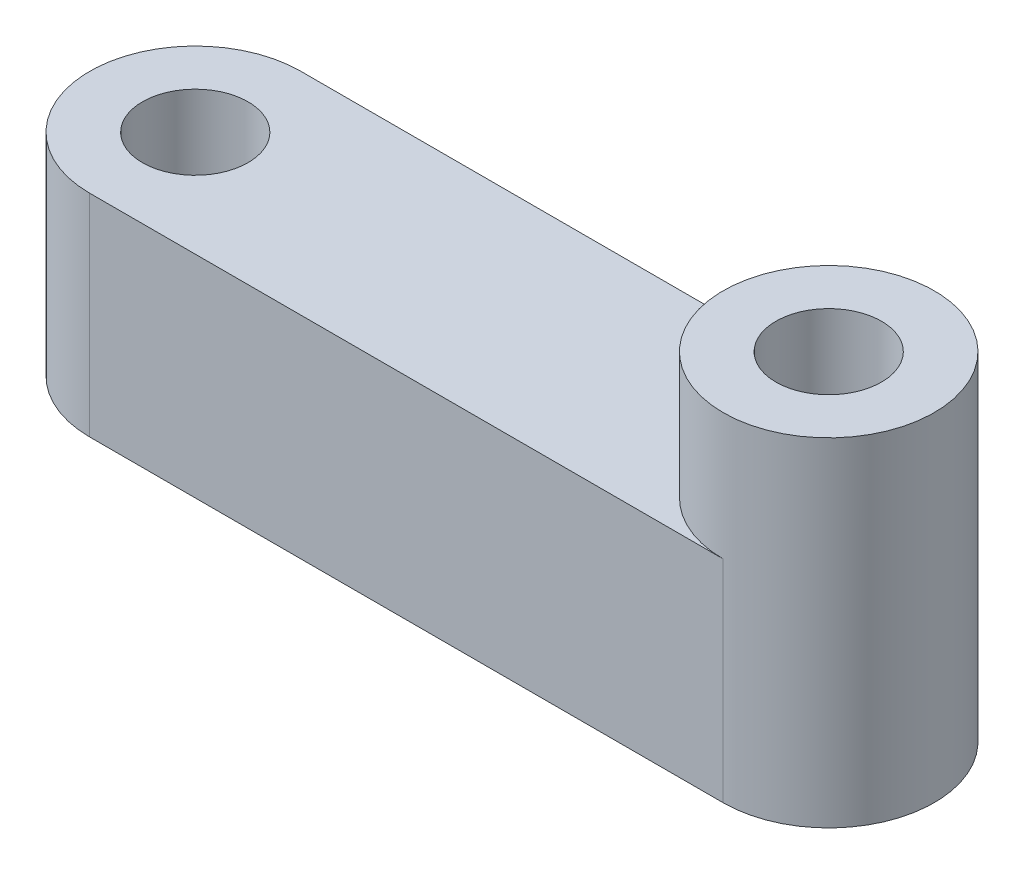
ISO-10303-21;
HEADER;
FILE_DESCRIPTION(('STEP AP214'),'2;1');
FILE_NAME('part.step','',(''),(''),'','','');
FILE_SCHEMA(('AUTOMOTIVE_DESIGN { 1 0 10303 214 1 1 1 1 }'));
ENDSEC;
DATA;
#1=APPLICATION_CONTEXT('core data for automotive mechanical design processes');
#2=APPLICATION_PROTOCOL_DEFINITION('international standard','automotive_design',2000,#1);
#3=PRODUCT_CONTEXT('',#1,'mechanical');
#4=PRODUCT('Part','Part','',(#3));
#5=PRODUCT_RELATED_PRODUCT_CATEGORY('part','',(#4));
#6=PRODUCT_DEFINITION_FORMATION('','',#4);
#7=PRODUCT_DEFINITION_CONTEXT('part definition',#1,'design');
#8=PRODUCT_DEFINITION('design','',#6,#7);
#9=PRODUCT_DEFINITION_SHAPE('','',#8);
#10=(LENGTH_UNIT() NAMED_UNIT(*) SI_UNIT(.MILLI.,.METRE.));
#11=(NAMED_UNIT(*) PLANE_ANGLE_UNIT() SI_UNIT($,.RADIAN.));
#12=(NAMED_UNIT(*) SI_UNIT($,.STERADIAN.) SOLID_ANGLE_UNIT());
#13=UNCERTAINTY_MEASURE_WITH_UNIT(LENGTH_MEASURE(1.E-05),#10,'distance_accuracy_value','');
#14=(GEOMETRIC_REPRESENTATION_CONTEXT(3) GLOBAL_UNCERTAINTY_ASSIGNED_CONTEXT((#13)) GLOBAL_UNIT_ASSIGNED_CONTEXT((#10,
#11,#12)) REPRESENTATION_CONTEXT('',''));
#15=CARTESIAN_POINT('',(0.,0.,0.));
#16=DIRECTION('',(0.,0.,1.));
#17=DIRECTION('',(1.,0.,0.));
#18=AXIS2_PLACEMENT_3D('',#15,#16,#17);
#19=CARTESIAN_POINT('',(0.,-6.,0.));
#20=DIRECTION('',(0.,1.,0.));
#21=DIRECTION('',(0.,0.,1.));
#22=AXIS2_PLACEMENT_3D('',#19,#20,#21);
#23=CYLINDRICAL_SURFACE('',#22,5.);
#24=DIRECTION('',(0.,1.,0.));
#25=VECTOR('',#24,1.);
#26=CARTESIAN_POINT('',(0.,-6.,5.));
#27=LINE('',#26,#25);
#28=CARTESIAN_POINT('',(0.,-6.,5.));
#29=VERTEX_POINT('',#28);
#30=CARTESIAN_POINT('',(0.,4.,5.));
#31=VERTEX_POINT('',#30);
#32=EDGE_CURVE('E91',#29,#31,#27,.T.);
#33=ORIENTED_EDGE('',*,*,#32,.T.);
#34=CARTESIAN_POINT('',(0.,4.,0.));
#35=DIRECTION('',(0.,1.,0.));
#36=DIRECTION('',(0.,0.,1.));
#37=AXIS2_PLACEMENT_3D('',#34,#35,#36);
#38=CIRCLE('',#37,5.);
#39=CARTESIAN_POINT('',(0.,4.,-5.));
#40=VERTEX_POINT('',#39);
#41=EDGE_CURVE('E80',#40,#31,#38,.T.);
#42=ORIENTED_EDGE('',*,*,#41,.F.);
#43=DIRECTION('',(0.,1.,0.));
#44=VECTOR('',#43,1.);
#45=CARTESIAN_POINT('',(0.,-6.,-5.));
#46=LINE('',#45,#44);
#47=CARTESIAN_POINT('',(0.,-6.,-5.));
#48=VERTEX_POINT('',#47);
#49=EDGE_CURVE('E40',#48,#40,#46,.T.);
#50=ORIENTED_EDGE('',*,*,#49,.F.);
#51=CARTESIAN_POINT('',(0.,-6.,0.));
#52=DIRECTION('',(0.,1.,0.));
#53=DIRECTION('',(0.,0.,1.));
#54=AXIS2_PLACEMENT_3D('',#51,#52,#53);
#55=CIRCLE('',#54,5.);
#56=EDGE_CURVE('E108',#48,#29,#55,.T.);
#57=ORIENTED_EDGE('',*,*,#56,.T.);
#58=EDGE_LOOP('',(#33,#42,#50,#57));
#59=FACE_BOUND('',#58,.T.);
#60=ADVANCED_FACE('F33',(#59),#23,.T.);
#61=CARTESIAN_POINT('',(0.,-6.,-5.));
#62=DIRECTION('',(0.,0.,-1.));
#63=DIRECTION('',(-1.,0.,0.));
#64=AXIS2_PLACEMENT_3D('',#61,#62,#63);
#65=PLANE('',#64);
#66=ORIENTED_EDGE('',*,*,#49,.T.);
#67=DIRECTION('',(-1.,0.,0.));
#68=VECTOR('',#67,1.);
#69=CARTESIAN_POINT('',(0.,4.,-5.));
#70=LINE('',#69,#68);
#71=CARTESIAN_POINT('',(30.,4.,-5.));
#72=VERTEX_POINT('',#71);
#73=EDGE_CURVE('E82',#72,#40,#70,.T.);
#74=ORIENTED_EDGE('',*,*,#73,.F.);
#75=DIRECTION('',(0.,1.,0.));
#76=VECTOR('',#75,1.);
#77=CARTESIAN_POINT('',(30.,-6.,-5.));
#78=LINE('',#77,#76);
#79=CARTESIAN_POINT('',(30.,-6.,-5.));
#80=VERTEX_POINT('',#79);
#81=EDGE_CURVE('E54',#80,#72,#78,.T.);
#82=ORIENTED_EDGE('',*,*,#81,.F.);
#83=DIRECTION('',(-1.,0.,0.));
#84=VECTOR('',#83,1.);
#85=CARTESIAN_POINT('',(0.,-6.,-5.));
#86=LINE('',#85,#84);
#87=EDGE_CURVE('E112',#80,#48,#86,.T.);
#88=ORIENTED_EDGE('',*,*,#87,.T.);
#89=EDGE_LOOP('',(#66,#74,#82,#88));
#90=FACE_BOUND('',#89,.T.);
#91=ADVANCED_FACE('F98',(#90),#65,.T.);
#92=CARTESIAN_POINT('',(30.,-6.,0.));
#93=DIRECTION('',(0.,1.,0.));
#94=DIRECTION('',(0.,0.,1.));
#95=AXIS2_PLACEMENT_3D('',#92,#93,#94);
#96=CYLINDRICAL_SURFACE('',#95,5.);
#97=ORIENTED_EDGE('',*,*,#81,.T.);
#98=CARTESIAN_POINT('',(30.,4.,0.));
#99=DIRECTION('',(0.,1.,0.));
#100=DIRECTION('',(0.,0.,1.));
#101=AXIS2_PLACEMENT_3D('',#98,#99,#100);
#102=CIRCLE('',#101,5.);
#103=CARTESIAN_POINT('',(30.,4.,5.));
#104=VERTEX_POINT('',#103);
#105=EDGE_CURVE('E11',#72,#104,#102,.T.);
#106=ORIENTED_EDGE('',*,*,#105,.T.);
#107=DIRECTION('',(0.,1.,0.));
#108=VECTOR('',#107,1.);
#109=CARTESIAN_POINT('',(30.,-6.,5.));
#110=LINE('',#109,#108);
#111=CARTESIAN_POINT('',(30.,-6.,5.));
#112=VERTEX_POINT('',#111);
#113=EDGE_CURVE('E85',#112,#104,#110,.T.);
#114=ORIENTED_EDGE('',*,*,#113,.F.);
#115=CARTESIAN_POINT('',(30.,-6.,0.));
#116=DIRECTION('',(0.,1.,0.));
#117=DIRECTION('',(0.,0.,1.));
#118=AXIS2_PLACEMENT_3D('',#115,#116,#117);
#119=CIRCLE('',#118,5.);
#120=EDGE_CURVE('E95',#112,#80,#119,.T.);
#121=ORIENTED_EDGE('',*,*,#120,.T.);
#122=EDGE_LOOP('',(#97,#106,#114,#121));
#123=FACE_BOUND('',#122,.T.);
#124=CARTESIAN_POINT('',(30.,10.,0.));
#125=DIRECTION('',(0.,1.,0.));
#126=DIRECTION('',(0.,0.,1.));
#127=AXIS2_PLACEMENT_3D('',#124,#125,#126);
#128=CIRCLE('',#127,5.);
#129=CARTESIAN_POINT('',(30.,10.,5.));
#130=VERTEX_POINT('',#129);
#131=EDGE_CURVE('E131',#130,#130,#128,.T.);
#132=ORIENTED_EDGE('',*,*,#131,.F.);
#133=EDGE_LOOP('',(#132));
#134=FACE_BOUND('',#133,.T.);
#135=ADVANCED_FACE('F93',(#123,#134),#96,.T.);
#136=CARTESIAN_POINT('',(0.,-6.,5.));
#137=DIRECTION('',(0.,0.,1.));
#138=DIRECTION('',(1.,0.,0.));
#139=AXIS2_PLACEMENT_3D('',#136,#137,#138);
#140=PLANE('',#139);
#141=ORIENTED_EDGE('',*,*,#113,.T.);
#142=DIRECTION('',(1.,0.,0.));
#143=VECTOR('',#142,1.);
#144=CARTESIAN_POINT('',(0.,4.,5.));
#145=LINE('',#144,#143);
#146=EDGE_CURVE('E75',#31,#104,#145,.T.);
#147=ORIENTED_EDGE('',*,*,#146,.F.);
#148=ORIENTED_EDGE('',*,*,#32,.F.);
#149=DIRECTION('',(1.,0.,0.));
#150=VECTOR('',#149,1.);
#151=CARTESIAN_POINT('',(0.,-6.,5.));
#152=LINE('',#151,#150);
#153=EDGE_CURVE('E88',#29,#112,#152,.T.);
#154=ORIENTED_EDGE('',*,*,#153,.T.);
#155=EDGE_LOOP('',(#141,#147,#148,#154));
#156=FACE_BOUND('',#155,.T.);
#157=ADVANCED_FACE('F86',(#156),#140,.T.);
#158=CARTESIAN_POINT('',(0.,-6.,0.));
#159=DIRECTION('',(0.,1.,0.));
#160=DIRECTION('',(0.,0.,1.));
#161=AXIS2_PLACEMENT_3D('',#158,#159,#160);
#162=PLANE('',#161);
#163=CARTESIAN_POINT('',(0.,-6.,0.));
#164=DIRECTION('',(0.,1.,0.));
#165=DIRECTION('',(0.,0.,1.));
#166=AXIS2_PLACEMENT_3D('',#163,#164,#165);
#167=CIRCLE('',#166,2.5);
#168=CARTESIAN_POINT('',(0.,-6.,2.5));
#169=VERTEX_POINT('',#168);
#170=EDGE_CURVE('E102',#169,#169,#167,.T.);
#171=ORIENTED_EDGE('',*,*,#170,.T.);
#172=EDGE_LOOP('',(#171));
#173=FACE_BOUND('',#172,.T.);
#174=ORIENTED_EDGE('',*,*,#87,.F.);
#175=ORIENTED_EDGE('',*,*,#120,.F.);
#176=ORIENTED_EDGE('',*,*,#153,.F.);
#177=ORIENTED_EDGE('',*,*,#56,.F.);
#178=EDGE_LOOP('',(#174,#175,#176,#177));
#179=FACE_BOUND('',#178,.T.);
#180=CARTESIAN_POINT('',(30.,-6.,0.));
#181=DIRECTION('',(0.,1.,0.));
#182=DIRECTION('',(0.,0.,1.));
#183=AXIS2_PLACEMENT_3D('',#180,#181,#182);
#184=CIRCLE('',#183,2.5);
#185=CARTESIAN_POINT('',(30.,-6.,2.5));
#186=VERTEX_POINT('',#185);
#187=EDGE_CURVE('E99',#186,#186,#184,.T.);
#188=ORIENTED_EDGE('',*,*,#187,.T.);
#189=EDGE_LOOP('',(#188));
#190=FACE_BOUND('',#189,.T.);
#191=ADVANCED_FACE('F115',(#173,#179,#190),#162,.F.);
#192=CARTESIAN_POINT('',(0.,-6.,0.));
#193=DIRECTION('',(0.,1.,0.));
#194=DIRECTION('',(0.,0.,1.));
#195=AXIS2_PLACEMENT_3D('',#192,#193,#194);
#196=CYLINDRICAL_SURFACE('',#195,2.5);
#197=ORIENTED_EDGE('',*,*,#170,.F.);
#198=EDGE_LOOP('',(#197));
#199=FACE_BOUND('',#198,.T.);
#200=CARTESIAN_POINT('',(0.,4.,0.));
#201=DIRECTION('',(0.,1.,0.));
#202=DIRECTION('',(0.,0.,1.));
#203=AXIS2_PLACEMENT_3D('',#200,#201,#202);
#204=CIRCLE('',#203,2.5);
#205=CARTESIAN_POINT('',(0.,4.,2.5));
#206=VERTEX_POINT('',#205);
#207=EDGE_CURVE('E134',#206,#206,#204,.T.);
#208=ORIENTED_EDGE('',*,*,#207,.T.);
#209=EDGE_LOOP('',(#208));
#210=FACE_BOUND('',#209,.T.);
#211=ADVANCED_FACE('F118',(#199,#210),#196,.F.);
#212=CARTESIAN_POINT('',(30.,-6.,0.));
#213=DIRECTION('',(0.,1.,0.));
#214=DIRECTION('',(0.,0.,1.));
#215=AXIS2_PLACEMENT_3D('',#212,#213,#214);
#216=CYLINDRICAL_SURFACE('',#215,2.5);
#217=ORIENTED_EDGE('',*,*,#187,.F.);
#218=EDGE_LOOP('',(#217));
#219=FACE_BOUND('',#218,.T.);
#220=CARTESIAN_POINT('',(30.,10.,0.));
#221=DIRECTION('',(0.,1.,0.));
#222=DIRECTION('',(0.,0.,1.));
#223=AXIS2_PLACEMENT_3D('',#220,#221,#222);
#224=CIRCLE('',#223,2.5);
#225=CARTESIAN_POINT('',(30.,10.,2.5));
#226=VERTEX_POINT('',#225);
#227=EDGE_CURVE('E129',#226,#226,#224,.T.);
#228=ORIENTED_EDGE('',*,*,#227,.T.);
#229=EDGE_LOOP('',(#228));
#230=FACE_BOUND('',#229,.T.);
#231=ADVANCED_FACE('F123',(#219,#230),#216,.F.);
#232=CARTESIAN_POINT('',(0.,4.,0.));
#233=DIRECTION('',(0.,1.,0.));
#234=DIRECTION('',(0.,0.,1.));
#235=AXIS2_PLACEMENT_3D('',#232,#233,#234);
#236=PLANE('',#235);
#237=ORIENTED_EDGE('',*,*,#105,.F.);
#238=ORIENTED_EDGE('',*,*,#73,.T.);
#239=ORIENTED_EDGE('',*,*,#41,.T.);
#240=ORIENTED_EDGE('',*,*,#146,.T.);
#241=EDGE_LOOP('',(#237,#238,#239,#240));
#242=FACE_BOUND('',#241,.T.);
#243=ORIENTED_EDGE('',*,*,#207,.F.);
#244=EDGE_LOOP('',(#243));
#245=FACE_BOUND('',#244,.T.);
#246=ADVANCED_FACE('F77',(#242,#245),#236,.T.);
#247=CARTESIAN_POINT('',(30.,10.,0.));
#248=DIRECTION('',(0.,1.,0.));
#249=DIRECTION('',(0.,0.,1.));
#250=AXIS2_PLACEMENT_3D('',#247,#248,#249);
#251=PLANE('',#250);
#252=ORIENTED_EDGE('',*,*,#131,.T.);
#253=EDGE_LOOP('',(#252));
#254=FACE_BOUND('',#253,.T.);
#255=ORIENTED_EDGE('',*,*,#227,.F.);
#256=EDGE_LOOP('',(#255));
#257=FACE_BOUND('',#256,.T.);
#258=ADVANCED_FACE('F141',(#254,#257),#251,.T.);
#259=CLOSED_SHELL('',(#60,#91,#135,#157,#191,#211,#231,#246,#258));
#260=MANIFOLD_SOLID_BREP('B2',#259);
#261=ADVANCED_BREP_SHAPE_REPRESENTATION('',(#18,#260),#14);
#262=SHAPE_DEFINITION_REPRESENTATION(#9,#261);
ENDSEC;
END-ISO-10303-21;
